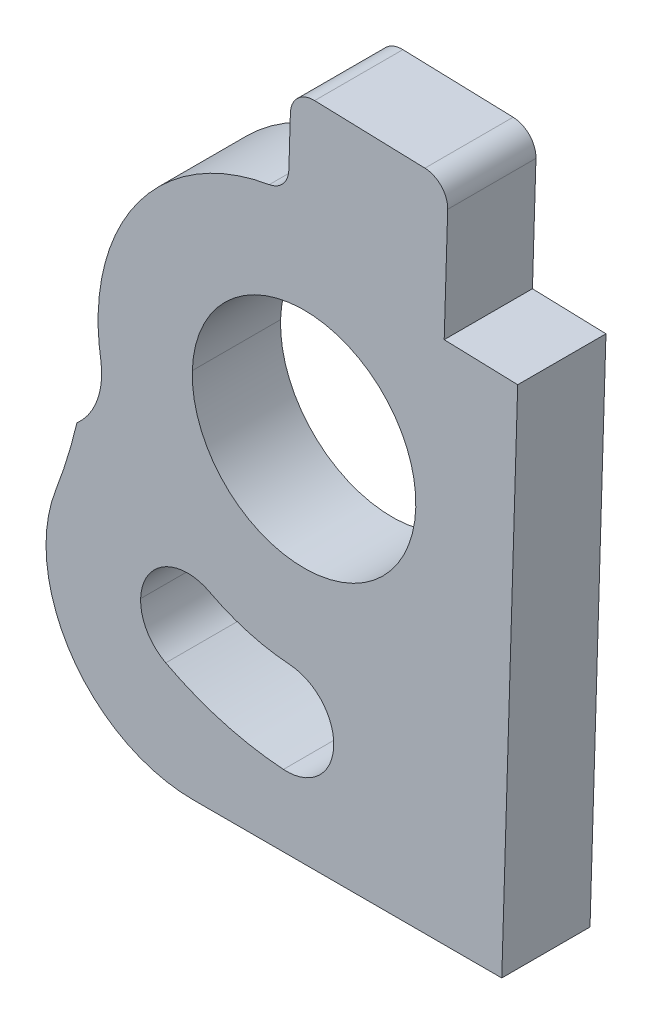
ISO-10303-21;
HEADER;
FILE_DESCRIPTION(('STEP AP214'),'2;1');
FILE_NAME('part.step','',(''),(''),'','','');
FILE_SCHEMA(('AUTOMOTIVE_DESIGN { 1 0 10303 214 1 1 1 1 }'));
ENDSEC;
DATA;
#1=APPLICATION_CONTEXT('core data for automotive mechanical design processes');
#2=APPLICATION_PROTOCOL_DEFINITION('international standard','automotive_design',2000,#1);
#3=PRODUCT_CONTEXT('',#1,'mechanical');
#4=PRODUCT('Part','Part','',(#3));
#5=PRODUCT_RELATED_PRODUCT_CATEGORY('part','',(#4));
#6=PRODUCT_DEFINITION_FORMATION('','',#4);
#7=PRODUCT_DEFINITION_CONTEXT('part definition',#1,'design');
#8=PRODUCT_DEFINITION('design','',#6,#7);
#9=PRODUCT_DEFINITION_SHAPE('','',#8);
#10=(LENGTH_UNIT() NAMED_UNIT(*) SI_UNIT(.MILLI.,.METRE.));
#11=(NAMED_UNIT(*) PLANE_ANGLE_UNIT() SI_UNIT($,.RADIAN.));
#12=(NAMED_UNIT(*) SI_UNIT($,.STERADIAN.) SOLID_ANGLE_UNIT());
#13=UNCERTAINTY_MEASURE_WITH_UNIT(LENGTH_MEASURE(1.E-05),#10,'distance_accuracy_value','');
#14=(GEOMETRIC_REPRESENTATION_CONTEXT(3) GLOBAL_UNCERTAINTY_ASSIGNED_CONTEXT((#13)) GLOBAL_UNIT_ASSIGNED_CONTEXT((#10,
#11,#12)) REPRESENTATION_CONTEXT('',''));
#15=CARTESIAN_POINT('',(0.,0.,0.));
#16=DIRECTION('',(0.,0.,1.));
#17=DIRECTION('',(1.,0.,0.));
#18=AXIS2_PLACEMENT_3D('',#15,#16,#17);
#19=CARTESIAN_POINT('',(8.92977845680518,-7.50608066992846,-4.));
#20=DIRECTION('',(0.,0.,-1.));
#21=DIRECTION('',(-1.,0.,0.));
#22=AXIS2_PLACEMENT_3D('',#19,#20,#21);
#23=CYLINDRICAL_SURFACE('',#22,5.);
#24=CARTESIAN_POINT('',(8.92977845680518,-7.50608066992846,-4.));
#25=DIRECTION('',(0.,0.,1.));
#26=DIRECTION('',(1.,0.,0.));
#27=AXIS2_PLACEMENT_3D('',#24,#25,#26);
#28=CIRCLE('',#27,5.);
#29=CARTESIAN_POINT('',(3.92977845680518,-7.50608066992846,-4.));
#30=VERTEX_POINT('',#29);
#31=CARTESIAN_POINT('',(8.92977370594984,-12.5060806699285,-4.));
#32=VERTEX_POINT('',#31);
#33=EDGE_CURVE('E40',#30,#32,#28,.T.);
#34=ORIENTED_EDGE('',*,*,#33,.F.);
#35=DIRECTION('',(0.,0.,-1.));
#36=VECTOR('',#35,1.);
#37=CARTESIAN_POINT('',(3.92977845680518,-7.50608066992846,-4.));
#38=LINE('',#37,#36);
#39=CARTESIAN_POINT('',(3.92977845680518,-7.50608066992846,-7.));
#40=VERTEX_POINT('',#39);
#41=EDGE_CURVE('E11',#30,#40,#38,.T.);
#42=ORIENTED_EDGE('',*,*,#41,.T.);
#43=CARTESIAN_POINT('',(8.92977845680518,-7.50608066992846,-7.));
#44=DIRECTION('',(0.,0.,-1.));
#45=DIRECTION('',(1.,0.,0.));
#46=AXIS2_PLACEMENT_3D('',#43,#44,#45);
#47=CIRCLE('',#46,5.);
#48=CARTESIAN_POINT('',(8.92977370594984,-12.5060806699285,-7.));
#49=VERTEX_POINT('',#48);
#50=EDGE_CURVE('E291',#49,#40,#47,.T.);
#51=ORIENTED_EDGE('',*,*,#50,.F.);
#52=DIRECTION('',(0.,0.,-1.));
#53=VECTOR('',#52,1.);
#54=CARTESIAN_POINT('',(8.92977845680518,-12.5060806699285,-4.));
#55=LINE('',#54,#53);
#56=EDGE_CURVE('E262',#32,#49,#55,.T.);
#57=ORIENTED_EDGE('',*,*,#56,.F.);
#58=EDGE_LOOP('',(#34,#42,#51,#57));
#59=FACE_BOUND('',#58,.T.);
#60=ADVANCED_FACE('F17',(#59),#23,.T.);
#61=CARTESIAN_POINT('',(12.7,0.,-4.));
#62=DIRECTION('',(0.,0.,-1.));
#63=DIRECTION('',(-0.999533590836713,0.0305385132098226,0.));
#64=AXIS2_PLACEMENT_3D('',#61,#62,#63);
#65=CYLINDRICAL_SURFACE('',#64,3.8);
#66=CARTESIAN_POINT('',(12.7,0.,-4.));
#67=DIRECTION('',(0.,0.,1.));
#68=DIRECTION('',(0.999533590836713,-0.0305385132098226,0.));
#69=AXIS2_PLACEMENT_3D('',#66,#67,#68);
#70=CIRCLE('',#69,3.8);
#71=CARTESIAN_POINT('',(8.90177235482049,0.116046350197326,-4.));
#72=VERTEX_POINT('',#71);
#73=CARTESIAN_POINT('',(16.4982276451795,-0.116046350197326,-4.));
#74=VERTEX_POINT('',#73);
#75=EDGE_CURVE('E28',#72,#74,#70,.T.);
#76=ORIENTED_EDGE('',*,*,#75,.T.);
#77=DIRECTION('',(0.,0.,-1.));
#78=VECTOR('',#77,1.);
#79=CARTESIAN_POINT('',(16.4982276451795,-0.116046350197325,-4.));
#80=LINE('',#79,#78);
#81=CARTESIAN_POINT('',(16.4982276451795,-0.116046350197326,-7.));
#82=VERTEX_POINT('',#81);
#83=EDGE_CURVE('E216',#74,#82,#80,.T.);
#84=ORIENTED_EDGE('',*,*,#83,.T.);
#85=CARTESIAN_POINT('',(12.7,0.,-7.));
#86=DIRECTION('',(0.,0.,1.));
#87=DIRECTION('',(0.999533590836713,-0.0305385132098226,0.));
#88=AXIS2_PLACEMENT_3D('',#85,#86,#87);
#89=CIRCLE('',#88,3.8);
#90=CARTESIAN_POINT('',(8.90177235482049,0.116046350197326,-7.));
#91=VERTEX_POINT('',#90);
#92=EDGE_CURVE('E287',#91,#82,#89,.T.);
#93=ORIENTED_EDGE('',*,*,#92,.F.);
#94=DIRECTION('',(0.,0.,-1.));
#95=VECTOR('',#94,1.);
#96=CARTESIAN_POINT('',(8.90177235482049,0.116046350197326,-4.));
#97=LINE('',#96,#95);
#98=EDGE_CURVE('E230',#72,#91,#97,.T.);
#99=ORIENTED_EDGE('',*,*,#98,.F.);
#100=EDGE_LOOP('',(#76,#84,#93,#99));
#101=FACE_BOUND('',#100,.T.);
#102=ADVANCED_FACE('F229',(#101),#65,.F.);
#103=CARTESIAN_POINT('',(12.7,0.,-4.));
#104=DIRECTION('',(0.,0.,-1.));
#105=DIRECTION('',(-0.999533590836713,0.0305385132098226,0.));
#106=AXIS2_PLACEMENT_3D('',#103,#104,#105);
#107=CYLINDRICAL_SURFACE('',#106,7.);
#108=CARTESIAN_POINT('',(12.7,0.,-4.));
#109=DIRECTION('',(0.,0.,1.));
#110=DIRECTION('',(0.998134798421867,-0.0610485395348597,0.));
#111=AXIS2_PLACEMENT_3D('',#108,#109,#110);
#112=CIRCLE('',#111,7.);
#113=CARTESIAN_POINT('',(5.70326486414301,0.213769592468759,-4.));
#114=VERTEX_POINT('',#113);
#115=CARTESIAN_POINT('',(5.78949751220482,-1.11577567914728,-4.));
#116=VERTEX_POINT('',#115);
#117=EDGE_CURVE('E268',#114,#116,#112,.T.);
#118=ORIENTED_EDGE('',*,*,#117,.F.);
#119=DIRECTION('',(0.,0.,-1.));
#120=VECTOR('',#119,1.);
#121=CARTESIAN_POINT('',(5.70326486414301,0.213769592468759,-4.));
#122=LINE('',#121,#120);
#123=CARTESIAN_POINT('',(5.70326486414301,0.213769592468759,-7.));
#124=VERTEX_POINT('',#123);
#125=EDGE_CURVE('E226',#114,#124,#122,.T.);
#126=ORIENTED_EDGE('',*,*,#125,.T.);
#127=CARTESIAN_POINT('',(12.7,0.,-7.));
#128=DIRECTION('',(0.,0.,1.));
#129=DIRECTION('',(0.998134798421867,-0.0610485395348597,0.));
#130=AXIS2_PLACEMENT_3D('',#127,#128,#129);
#131=CIRCLE('',#130,7.);
#132=CARTESIAN_POINT('',(5.78949751220482,-1.11577567914728,-7.));
#133=VERTEX_POINT('',#132);
#134=EDGE_CURVE('E336',#124,#133,#131,.T.);
#135=ORIENTED_EDGE('',*,*,#134,.T.);
#136=DIRECTION('',(0.,0.,-1.));
#137=VECTOR('',#136,1.);
#138=CARTESIAN_POINT('',(5.78949751220482,-1.11577567914728,-4.));
#139=LINE('',#138,#137);
#140=EDGE_CURVE('E237',#116,#133,#139,.T.);
#141=ORIENTED_EDGE('',*,*,#140,.F.);
#142=EDGE_LOOP('',(#118,#126,#135,#141));
#143=FACE_BOUND('',#142,.T.);
#144=ADVANCED_FACE('F490',(#143),#107,.T.);
#145=CARTESIAN_POINT('',(8.74394464196289,-7.523272293633,-4.));
#146=DIRECTION('',(0.,0.,-1.));
#147=DIRECTION('',(-0.999533590836713,0.0305385132098228,0.));
#148=AXIS2_PLACEMENT_3D('',#145,#146,#147);
#149=CYLINDRICAL_SURFACE('',#148,1.6);
#150=CARTESIAN_POINT('',(8.74394464196289,-7.523272293633,-4.));
#151=DIRECTION('',(0.,0.,-1.));
#152=DIRECTION('',(0.999533590836713,-0.0305385132098223,0.));
#153=AXIS2_PLACEMENT_3D('',#150,#151,#152);
#154=CIRCLE('',#153,1.6);
#155=CARTESIAN_POINT('',(7.14469089662415,-7.47441067249728,-4.));
#156=VERTEX_POINT('',#155);
#157=CARTESIAN_POINT('',(9.48861388582412,-6.10712692071144,-4.));
#158=VERTEX_POINT('',#157);
#159=EDGE_CURVE('E282',#156,#158,#154,.T.);
#160=ORIENTED_EDGE('',*,*,#159,.F.);
#161=DIRECTION('',(0.,0.,-1.));
#162=VECTOR('',#161,1.);
#163=CARTESIAN_POINT('',(7.14469089662415,-7.47441067249728,-4.));
#164=LINE('',#163,#162);
#165=CARTESIAN_POINT('',(7.14469089662415,-7.47441067249728,-7.));
#166=VERTEX_POINT('',#165);
#167=EDGE_CURVE('E332',#156,#166,#164,.T.);
#168=ORIENTED_EDGE('',*,*,#167,.T.);
#169=CARTESIAN_POINT('',(8.74394464196289,-7.523272293633,-7.));
#170=DIRECTION('',(0.,0.,-1.));
#171=DIRECTION('',(0.999533590836713,-0.0305385132098223,0.));
#172=AXIS2_PLACEMENT_3D('',#169,#170,#171);
#173=CIRCLE('',#172,1.6);
#174=CARTESIAN_POINT('',(9.48861388582412,-6.10712692071144,-7.));
#175=VERTEX_POINT('',#174);
#176=EDGE_CURVE('E337',#166,#175,#173,.T.);
#177=ORIENTED_EDGE('',*,*,#176,.T.);
#178=DIRECTION('',(0.,0.,-1.));
#179=VECTOR('',#178,1.);
#180=CARTESIAN_POINT('',(9.48861388582412,-6.10712692071144,-4.));
#181=LINE('',#180,#179);
#182=EDGE_CURVE('E296',#158,#175,#181,.T.);
#183=ORIENTED_EDGE('',*,*,#182,.F.);
#184=EDGE_LOOP('',(#160,#168,#177,#183));
#185=FACE_BOUND('',#184,.T.);
#186=ADVANCED_FACE('F762',(#185),#149,.F.);
#187=CARTESIAN_POINT('',(8.74394464196289,-7.523272293633,-4.));
#188=DIRECTION('',(0.,0.,-1.));
#189=DIRECTION('',(-0.999533590836713,0.0305385132098228,0.));
#190=AXIS2_PLACEMENT_3D('',#187,#188,#189);
#191=CYLINDRICAL_SURFACE('',#190,1.6);
#192=ORIENTED_EDGE('',*,*,#167,.F.);
#193=CARTESIAN_POINT('',(8.74394464196289,-7.523272293633,-4.));
#194=DIRECTION('',(0.,0.,-1.));
#195=DIRECTION('',(0.999533590836713,-0.0305385132098223,0.));
#196=AXIS2_PLACEMENT_3D('',#193,#194,#195);
#197=CIRCLE('',#196,1.6);
#198=CARTESIAN_POINT('',(7.99927539809305,-8.93941766655003,-4.));
#199=VERTEX_POINT('',#198);
#200=EDGE_CURVE('E278',#199,#156,#197,.T.);
#201=ORIENTED_EDGE('',*,*,#200,.F.);
#202=DIRECTION('',(0.,0.,-1.));
#203=VECTOR('',#202,1.);
#204=CARTESIAN_POINT('',(7.99927539809305,-8.93941766655003,-4.));
#205=LINE('',#204,#203);
#206=CARTESIAN_POINT('',(7.99927539809305,-8.93941766655003,-7.));
#207=VERTEX_POINT('',#206);
#208=EDGE_CURVE('E250',#199,#207,#205,.T.);
#209=ORIENTED_EDGE('',*,*,#208,.T.);
#210=CARTESIAN_POINT('',(8.74394464196289,-7.523272293633,-7.));
#211=DIRECTION('',(0.,0.,-1.));
#212=DIRECTION('',(0.999533590836713,-0.0305385132098223,0.));
#213=AXIS2_PLACEMENT_3D('',#210,#211,#212);
#214=CIRCLE('',#213,1.6);
#215=EDGE_CURVE('E348',#207,#166,#214,.T.);
#216=ORIENTED_EDGE('',*,*,#215,.T.);
#217=EDGE_LOOP('',(#192,#201,#209,#216));
#218=FACE_BOUND('',#217,.T.);
#219=ADVANCED_FACE('F757',(#218),#191,.F.);
#220=CARTESIAN_POINT('',(12.7,0.,-4.));
#221=DIRECTION('',(0.,0.,-1.));
#222=DIRECTION('',(-0.999533590836713,0.0305385132098226,0.));
#223=AXIS2_PLACEMENT_3D('',#220,#221,#222);
#224=CYLINDRICAL_SURFACE('',#223,6.9);
#225=CARTESIAN_POINT('',(12.7,0.,-7.));
#226=DIRECTION('',(0.,0.,1.));
#227=DIRECTION('',(0.999533590836713,-0.0305385132098226,0.));
#228=AXIS2_PLACEMENT_3D('',#225,#226,#227);
#229=CIRCLE('',#228,6.9);
#230=CARTESIAN_POINT('',(12.2216857109617,-6.88340144411917,-7.));
#231=VERTEX_POINT('',#230);
#232=EDGE_CURVE('E299',#175,#231,#229,.T.);
#233=ORIENTED_EDGE('',*,*,#232,.T.);
#234=DIRECTION('',(0.,0.,-1.));
#235=VECTOR('',#234,1.);
#236=CARTESIAN_POINT('',(12.2216857109617,-6.88340144411917,-4.));
#237=LINE('',#236,#235);
#238=CARTESIAN_POINT('',(12.2216857109617,-6.88340144411917,-4.));
#239=VERTEX_POINT('',#238);
#240=EDGE_CURVE('E264',#239,#231,#237,.T.);
#241=ORIENTED_EDGE('',*,*,#240,.F.);
#242=CARTESIAN_POINT('',(12.7,0.,-4.));
#243=DIRECTION('',(0.,0.,1.));
#244=DIRECTION('',(0.999533590836713,-0.0305385132098226,0.));
#245=AXIS2_PLACEMENT_3D('',#242,#243,#244);
#246=CIRCLE('',#245,6.9);
#247=EDGE_CURVE('E283',#158,#239,#246,.T.);
#248=ORIENTED_EDGE('',*,*,#247,.F.);
#249=ORIENTED_EDGE('',*,*,#182,.T.);
#250=EDGE_LOOP('',(#233,#241,#248,#249));
#251=FACE_BOUND('',#250,.T.);
#252=ADVANCED_FACE('F761',(#251),#224,.T.);
#253=CARTESIAN_POINT('',(12.110772252634,-8.47955250362507,-4.));
#254=DIRECTION('',(0.,0.,-1.));
#255=DIRECTION('',(-0.999533590836713,0.0305385132098228,0.));
#256=AXIS2_PLACEMENT_3D('',#253,#254,#255);
#257=CYLINDRICAL_SURFACE('',#256,1.6);
#258=CARTESIAN_POINT('',(12.110772252634,-8.47955250362507,-7.));
#259=DIRECTION('',(0.,0.,-1.));
#260=DIRECTION('',(0.999533590836713,-0.0305385132098228,0.));
#261=AXIS2_PLACEMENT_3D('',#258,#259,#260);
#262=CIRCLE('',#261,1.6);
#263=CARTESIAN_POINT('',(11.9998587943094,-10.0757035631312,-7.));
#264=VERTEX_POINT('',#263);
#265=EDGE_CURVE('E267',#231,#264,#262,.T.);
#266=ORIENTED_EDGE('',*,*,#265,.T.);
#267=DIRECTION('',(0.,0.,-1.));
#268=VECTOR('',#267,1.);
#269=CARTESIAN_POINT('',(11.9998587943094,-10.0757035631312,-4.));
#270=LINE('',#269,#268);
#271=CARTESIAN_POINT('',(11.9998587943094,-10.0757035631312,-4.));
#272=VERTEX_POINT('',#271);
#273=EDGE_CURVE('E318',#272,#264,#270,.T.);
#274=ORIENTED_EDGE('',*,*,#273,.F.);
#275=CARTESIAN_POINT('',(12.110772252634,-8.47955250362507,-4.));
#276=DIRECTION('',(0.,0.,-1.));
#277=DIRECTION('',(0.999533590836713,-0.0305385132098228,0.));
#278=AXIS2_PLACEMENT_3D('',#275,#276,#277);
#279=CIRCLE('',#278,1.6);
#280=EDGE_CURVE('E286',#239,#272,#279,.T.);
#281=ORIENTED_EDGE('',*,*,#280,.F.);
#282=ORIENTED_EDGE('',*,*,#240,.T.);
#283=EDGE_LOOP('',(#266,#274,#281,#282));
#284=FACE_BOUND('',#283,.T.);
#285=ADVANCED_FACE('F378',(#284),#257,.F.);
#286=CARTESIAN_POINT('',(19.3601122011978,-12.5060806699285,-4.));
#287=DIRECTION('',(0.,-1.,0.));
#288=DIRECTION('',(0.,0.,-1.));
#289=AXIS2_PLACEMENT_3D('',#286,#287,#288);
#290=PLANE('',#289);
#291=DIRECTION('',(1.,0.,0.));
#292=VECTOR('',#291,1.);
#293=CARTESIAN_POINT('',(19.3601122011978,-12.5060806699285,-4.));
#294=LINE('',#293,#292);
#295=CARTESIAN_POINT('',(19.421217727795,-12.5060806699285,-4.));
#296=VERTEX_POINT('',#295);
#297=EDGE_CURVE('E323',#32,#296,#294,.T.);
#298=ORIENTED_EDGE('',*,*,#297,.F.);
#299=ORIENTED_EDGE('',*,*,#56,.T.);
#300=DIRECTION('',(1.,0.,0.));
#301=VECTOR('',#300,1.);
#302=CARTESIAN_POINT('',(19.3601122011978,-12.5060806699285,-7.));
#303=LINE('',#302,#301);
#304=CARTESIAN_POINT('',(19.421217727795,-12.5060806699285,-7.));
#305=VERTEX_POINT('',#304);
#306=EDGE_CURVE('E258',#49,#305,#303,.T.);
#307=ORIENTED_EDGE('',*,*,#306,.T.);
#308=DIRECTION('',(0.,0.,-1.));
#309=VECTOR('',#308,1.);
#310=CARTESIAN_POINT('',(19.421217727795,-12.5060806699285,-4.));
#311=LINE('',#310,#309);
#312=EDGE_CURVE('E263',#296,#305,#311,.T.);
#313=ORIENTED_EDGE('',*,*,#312,.F.);
#314=EDGE_LOOP('',(#298,#299,#307,#313));
#315=FACE_BOUND('',#314,.T.);
#316=ADVANCED_FACE('F518',(#315),#290,.T.);
#317=CARTESIAN_POINT('',(19.6302535979471,-5.66428151384983,-4.));
#318=DIRECTION('',(-0.999533590836713,0.0305385132098226,0.));
#319=DIRECTION('',(0.,0.,1.));
#320=AXIS2_PLACEMENT_3D('',#317,#318,#319);
#321=PLANE('',#320);
#322=DIRECTION('',(0.,0.,-1.));
#323=VECTOR('',#322,1.);
#324=CARTESIAN_POINT('',(19.9631233919342,5.23063462627035,-4.));
#325=LINE('',#324,#323);
#326=CARTESIAN_POINT('',(19.9631233919342,5.23063462627035,-4.));
#327=VERTEX_POINT('',#326);
#328=CARTESIAN_POINT('',(19.9631233919342,5.23063462627035,-7.));
#329=VERTEX_POINT('',#328);
#330=EDGE_CURVE('E21',#327,#329,#325,.T.);
#331=ORIENTED_EDGE('',*,*,#330,.F.);
#332=DIRECTION('',(0.0305385132098226,0.999533590836713,0.));
#333=VECTOR('',#332,1.);
#334=CARTESIAN_POINT('',(19.6302535979471,-5.66428151384983,-4.));
#335=LINE('',#334,#333);
#336=EDGE_CURVE('E326',#296,#327,#335,.T.);
#337=ORIENTED_EDGE('',*,*,#336,.F.);
#338=ORIENTED_EDGE('',*,*,#312,.T.);
#339=DIRECTION('',(0.0305385132098226,0.999533590836713,0.));
#340=VECTOR('',#339,1.);
#341=CARTESIAN_POINT('',(19.6302535979471,-5.66428151384983,-7.));
#342=LINE('',#341,#340);
#343=EDGE_CURVE('E355',#305,#329,#342,.T.);
#344=ORIENTED_EDGE('',*,*,#343,.T.);
#345=EDGE_LOOP('',(#331,#337,#338,#344));
#346=FACE_BOUND('',#345,.T.);
#347=ADVANCED_FACE('F514',(#346),#321,.F.);
#348=CARTESIAN_POINT('',(21.6123538168192,5.180246079474,-4.));
#349=DIRECTION('',(-0.0305385132098228,-0.999533590836713,0.));
#350=DIRECTION('',(-0.999533590836713,0.0305385132098228,0.));
#351=AXIS2_PLACEMENT_3D('',#348,#349,#350);
#352=PLANE('',#351);
#353=DIRECTION('',(-0.999533590836713,0.0305385132098228,0.));
#354=VECTOR('',#353,1.);
#355=CARTESIAN_POINT('',(21.6123538168192,5.180246079474,-7.));
#356=LINE('',#355,#354);
#357=CARTESIAN_POINT('',(17.4642894148424,5.3069809092949,-7.));
#358=VERTEX_POINT('',#357);
#359=EDGE_CURVE('E359',#329,#358,#356,.T.);
#360=ORIENTED_EDGE('',*,*,#359,.T.);
#361=DIRECTION('',(0.,0.,-1.));
#362=VECTOR('',#361,1.);
#363=CARTESIAN_POINT('',(17.4642894148424,5.3069809092949,-4.));
#364=LINE('',#363,#362);
#365=CARTESIAN_POINT('',(17.4642894148424,5.3069809092949,-4.));
#366=VERTEX_POINT('',#365);
#367=EDGE_CURVE('E449',#366,#358,#364,.T.);
#368=ORIENTED_EDGE('',*,*,#367,.F.);
#369=DIRECTION('',(-0.999533590836713,0.0305385132098228,0.));
#370=VECTOR('',#369,1.);
#371=CARTESIAN_POINT('',(21.6123538168192,5.180246079474,-4.));
#372=LINE('',#371,#370);
#373=EDGE_CURVE('E399',#327,#366,#372,.T.);
#374=ORIENTED_EDGE('',*,*,#373,.F.);
#375=ORIENTED_EDGE('',*,*,#330,.T.);
#376=EDGE_LOOP('',(#360,#368,#374,#375));
#377=FACE_BOUND('',#376,.T.);
#378=ADVANCED_FACE('F795',(#377),#352,.F.);
#379=CARTESIAN_POINT('',(17.4642894148424,5.3069809092949,-4.));
#380=DIRECTION('',(-0.999533590836713,0.0305385132098226,0.));
#381=DIRECTION('',(0.,0.,1.));
#382=AXIS2_PLACEMENT_3D('',#379,#380,#381);
#383=PLANE('',#382);
#384=DIRECTION('',(0.0305385132098226,0.999533590836713,0.));
#385=VECTOR('',#384,1.);
#386=CARTESIAN_POINT('',(17.4642894148424,5.3069809092949,-4.));
#387=LINE('',#386,#385);
#388=CARTESIAN_POINT('',(17.5833896163607,9.20516191355808,-4.));
#389=VERTEX_POINT('',#388);
#390=EDGE_CURVE('E256',#366,#389,#387,.T.);
#391=ORIENTED_EDGE('',*,*,#390,.F.);
#392=ORIENTED_EDGE('',*,*,#367,.T.);
#393=DIRECTION('',(0.0305385132098226,0.999533590836713,0.));
#394=VECTOR('',#393,1.);
#395=CARTESIAN_POINT('',(17.4642894148424,5.3069809092949,-7.));
#396=LINE('',#395,#394);
#397=CARTESIAN_POINT('',(17.5833896163607,9.20516191355808,-7.));
#398=VERTEX_POINT('',#397);
#399=EDGE_CURVE('E415',#358,#398,#396,.T.);
#400=ORIENTED_EDGE('',*,*,#399,.T.);
#401=DIRECTION('',(0.,0.,1.));
#402=VECTOR('',#401,1.);
#403=CARTESIAN_POINT('',(17.5833896163607,9.20516191355808,-4.));
#404=LINE('',#403,#402);
#405=EDGE_CURVE('E411',#398,#389,#404,.T.);
#406=ORIENTED_EDGE('',*,*,#405,.T.);
#407=EDGE_LOOP('',(#391,#392,#400,#406));
#408=FACE_BOUND('',#407,.T.);
#409=ADVANCED_FACE('F520',(#408),#383,.F.);
#410=CARTESIAN_POINT('',(17.6078204269286,10.0047887862274,-4.));
#411=DIRECTION('',(-0.030538513209823,-0.999533590836713,0.));
#412=DIRECTION('',(-0.999533590836713,0.030538513209823,0.));
#413=AXIS2_PLACEMENT_3D('',#410,#411,#412);
#414=PLANE('',#413);
#415=DIRECTION('',(-0.999533590836713,0.030538513209823,0.));
#416=VECTOR('',#415,1.);
#417=CARTESIAN_POINT('',(17.6078204269286,10.0047887862274,-4.));
#418=LINE('',#417,#416);
#419=CARTESIAN_POINT('',(16.8081935542592,10.0292195967953,-4.));
#420=VERTEX_POINT('',#419);
#421=CARTESIAN_POINT('',(13.0599425886215,10.1437390213321,-4.));
#422=VERTEX_POINT('',#421);
#423=EDGE_CURVE('E257',#420,#422,#418,.T.);
#424=ORIENTED_EDGE('',*,*,#423,.F.);
#425=DIRECTION('',(0.,0.,-1.));
#426=VECTOR('',#425,1.);
#427=CARTESIAN_POINT('',(16.8081935542592,10.0292195967953,-4.));
#428=LINE('',#427,#426);
#429=CARTESIAN_POINT('',(16.8081935542592,10.0292195967953,-7.));
#430=VERTEX_POINT('',#429);
#431=EDGE_CURVE('E314',#420,#430,#428,.T.);
#432=ORIENTED_EDGE('',*,*,#431,.T.);
#433=DIRECTION('',(-0.999533590836713,0.030538513209823,0.));
#434=VECTOR('',#433,1.);
#435=CARTESIAN_POINT('',(17.6078204269286,10.0047887862274,-7.));
#436=LINE('',#435,#434);
#437=CARTESIAN_POINT('',(13.0599425886215,10.1437390213321,-7.));
#438=VERTEX_POINT('',#437);
#439=EDGE_CURVE('E304',#430,#438,#436,.T.);
#440=ORIENTED_EDGE('',*,*,#439,.T.);
#441=DIRECTION('',(0.,0.,1.));
#442=VECTOR('',#441,1.);
#443=CARTESIAN_POINT('',(13.0599425886215,10.1437390213321,-4.));
#444=LINE('',#443,#442);
#445=EDGE_CURVE('E300',#438,#422,#444,.T.);
#446=ORIENTED_EDGE('',*,*,#445,.T.);
#447=EDGE_LOOP('',(#424,#432,#440,#446));
#448=FACE_BOUND('',#447,.T.);
#449=ADVANCED_FACE('F803',(#448),#414,.F.);
#450=CARTESIAN_POINT('',(12.2603157159522,10.1681698319,-4.));
#451=DIRECTION('',(0.999533590836713,-0.0305385132098225,0.));
#452=DIRECTION('',(0.,0.,-1.));
#453=AXIS2_PLACEMENT_3D('',#450,#451,#452);
#454=PLANE('',#453);
#455=DIRECTION('',(-0.0305385132098225,-0.999533590836713,0.));
#456=VECTOR('',#455,1.);
#457=CARTESIAN_POINT('',(12.2603157159522,10.1681698319,-7.));
#458=LINE('',#457,#456);
#459=CARTESIAN_POINT('',(12.2358849053843,9.36854295923063,-7.));
#460=VERTEX_POINT('',#459);
#461=CARTESIAN_POINT('',(12.1837997128717,7.66378087262213,-7.));
#462=VERTEX_POINT('',#461);
#463=EDGE_CURVE('E305',#460,#462,#458,.T.);
#464=ORIENTED_EDGE('',*,*,#463,.T.);
#465=DIRECTION('',(0.,0.,1.));
#466=VECTOR('',#465,1.);
#467=CARTESIAN_POINT('',(12.1837997128717,7.66378087262213,-4.));
#468=LINE('',#467,#466);
#469=CARTESIAN_POINT('',(12.1837997128717,7.66378087262213,-4.));
#470=VERTEX_POINT('',#469);
#471=EDGE_CURVE('E309',#462,#470,#468,.T.);
#472=ORIENTED_EDGE('',*,*,#471,.T.);
#473=DIRECTION('',(-0.0305385132098225,-0.999533590836713,0.));
#474=VECTOR('',#473,1.);
#475=CARTESIAN_POINT('',(12.2603157159522,10.1681698319,-4.));
#476=LINE('',#475,#474);
#477=CARTESIAN_POINT('',(12.2358849053843,9.36854295923063,-4.));
#478=VERTEX_POINT('',#477);
#479=EDGE_CURVE('E341',#478,#470,#476,.T.);
#480=ORIENTED_EDGE('',*,*,#479,.F.);
#481=DIRECTION('',(0.,0.,-1.));
#482=VECTOR('',#481,1.);
#483=CARTESIAN_POINT('',(12.2358849053843,9.36854295923063,-4.));
#484=LINE('',#483,#482);
#485=EDGE_CURVE('E306',#478,#460,#484,.T.);
#486=ORIENTED_EDGE('',*,*,#485,.T.);
#487=EDGE_LOOP('',(#464,#472,#480,#486));
#488=FACE_BOUND('',#487,.T.);
#489=ADVANCED_FACE('F779',(#488),#454,.F.);
#490=CARTESIAN_POINT('',(12.7,0.,-4.));
#491=DIRECTION('',(0.,0.,-1.));
#492=DIRECTION('',(-0.999533590836713,0.0305385132098226,0.));
#493=AXIS2_PLACEMENT_3D('',#490,#491,#492);
#494=CYLINDRICAL_SURFACE('',#493,7.);
#495=ORIENTED_EDGE('',*,*,#125,.F.);
#496=CARTESIAN_POINT('',(12.7,0.,-4.));
#497=DIRECTION('',(0.,0.,1.));
#498=DIRECTION('',(0.998134798421867,-0.0610485395348597,0.));
#499=AXIS2_PLACEMENT_3D('',#496,#497,#498);
#500=CIRCLE('',#499,7.);
#501=CARTESIAN_POINT('',(11.5191294719765,6.89967715158076,-4.));
#502=VERTEX_POINT('',#501);
#503=EDGE_CURVE('E271',#502,#114,#500,.T.);
#504=ORIENTED_EDGE('',*,*,#503,.F.);
#505=DIRECTION('',(0.,0.,-1.));
#506=VECTOR('',#505,1.);
#507=CARTESIAN_POINT('',(11.5191294719765,6.89967715158076,-4.));
#508=LINE('',#507,#506);
#509=CARTESIAN_POINT('',(11.5191294719765,6.89967715158076,-7.));
#510=VERTEX_POINT('',#509);
#511=EDGE_CURVE('E310',#502,#510,#508,.T.);
#512=ORIENTED_EDGE('',*,*,#511,.T.);
#513=CARTESIAN_POINT('',(12.7,0.,-7.));
#514=DIRECTION('',(0.,0.,1.));
#515=DIRECTION('',(0.998134798421867,-0.0610485395348597,0.));
#516=AXIS2_PLACEMENT_3D('',#513,#514,#515);
#517=CIRCLE('',#516,7.);
#518=EDGE_CURVE('E322',#510,#124,#517,.T.);
#519=ORIENTED_EDGE('',*,*,#518,.T.);
#520=EDGE_LOOP('',(#495,#504,#512,#519));
#521=FACE_BOUND('',#520,.T.);
#522=ADVANCED_FACE('F474',(#521),#494,.T.);
#523=CARTESIAN_POINT('',(3.32146090942081,-1.51426699312845,-4.));
#524=DIRECTION('',(0.,0.,-1.));
#525=DIRECTION('',(-0.999533590836713,0.0305385132098226,0.));
#526=AXIS2_PLACEMENT_3D('',#523,#524,#525);
#527=CYLINDRICAL_SURFACE('',#526,2.5);
#528=CARTESIAN_POINT('',(3.32146090942081,-1.51426699312845,-7.));
#529=DIRECTION('',(0.,0.,-1.));
#530=DIRECTION('',(0.998134798421867,-0.0610485395348593,0.));
#531=AXIS2_PLACEMENT_3D('',#528,#529,#530);
#532=CIRCLE('',#531,2.5);
#533=CARTESIAN_POINT('',(4.97815807484942,-3.38652619047823,-7.));
#534=VERTEX_POINT('',#533);
#535=EDGE_CURVE('E244',#133,#534,#532,.T.);
#536=ORIENTED_EDGE('',*,*,#535,.T.);
#537=DIRECTION('',(0.,0.,-1.));
#538=VECTOR('',#537,1.);
#539=CARTESIAN_POINT('',(4.97815807484941,-3.38652619047824,-5.5));
#540=LINE('',#539,#538);
#541=CARTESIAN_POINT('',(4.97815807484942,-3.38652619047823,-4.));
#542=VERTEX_POINT('',#541);
#543=EDGE_CURVE('E273',#542,#534,#540,.T.);
#544=ORIENTED_EDGE('',*,*,#543,.F.);
#545=CARTESIAN_POINT('',(3.32146090942081,-1.51426699312845,-4.));
#546=DIRECTION('',(0.,0.,-1.));
#547=DIRECTION('',(0.998134798421867,-0.0610485395348593,0.));
#548=AXIS2_PLACEMENT_3D('',#545,#546,#547);
#549=CIRCLE('',#548,2.5);
#550=EDGE_CURVE('E272',#116,#542,#549,.T.);
#551=ORIENTED_EDGE('',*,*,#550,.F.);
#552=ORIENTED_EDGE('',*,*,#140,.T.);
#553=EDGE_LOOP('',(#536,#544,#551,#552));
#554=FACE_BOUND('',#553,.T.);
#555=ADVANCED_FACE('F778',(#554),#527,.F.);
#556=CARTESIAN_POINT('',(12.7,0.,-4.));
#557=DIRECTION('',(0.,0.,-1.));
#558=DIRECTION('',(-0.999533590836713,0.0305385132098226,0.));
#559=AXIS2_PLACEMENT_3D('',#556,#557,#558);
#560=CYLINDRICAL_SURFACE('',#559,3.8);
#561=ORIENTED_EDGE('',*,*,#83,.F.);
#562=CARTESIAN_POINT('',(12.7,0.,-4.));
#563=DIRECTION('',(0.,0.,1.));
#564=DIRECTION('',(0.999533590836713,-0.0305385132098226,0.));
#565=AXIS2_PLACEMENT_3D('',#562,#563,#564);
#566=CIRCLE('',#565,3.8);
#567=EDGE_CURVE('E221',#74,#72,#566,.T.);
#568=ORIENTED_EDGE('',*,*,#567,.T.);
#569=ORIENTED_EDGE('',*,*,#98,.T.);
#570=CARTESIAN_POINT('',(12.7,0.,-7.));
#571=DIRECTION('',(0.,0.,1.));
#572=DIRECTION('',(0.999533590836713,-0.0305385132098226,0.));
#573=AXIS2_PLACEMENT_3D('',#570,#571,#572);
#574=CIRCLE('',#573,3.8);
#575=EDGE_CURVE('E223',#82,#91,#574,.T.);
#576=ORIENTED_EDGE('',*,*,#575,.F.);
#577=EDGE_LOOP('',(#561,#568,#569,#576));
#578=FACE_BOUND('',#577,.T.);
#579=ADVANCED_FACE('F218',(#578),#560,.F.);
#580=CARTESIAN_POINT('',(-12.6881532072525,0.775678235529495,-4.));
#581=DIRECTION('',(0.,0.,-1.));
#582=DIRECTION('',(-0.999533590836713,0.0305385132098226,0.));
#583=AXIS2_PLACEMENT_3D('',#580,#581,#582);
#584=CYLINDRICAL_SURFACE('',#583,18.15);
#585=CARTESIAN_POINT('',(-12.6881532072525,0.775678235529495,-7.));
#586=DIRECTION('',(0.,0.,-1.));
#587=DIRECTION('',(1.,0.,0.));
#588=AXIS2_PLACEMENT_3D('',#585,#586,#587);
#589=CIRCLE('',#588,18.15);
#590=CARTESIAN_POINT('',(4.26067874534563,-5.71736384369564,-7.));
#591=VERTEX_POINT('',#590);
#592=EDGE_CURVE('E246',#534,#591,#589,.T.);
#593=ORIENTED_EDGE('',*,*,#592,.T.);
#594=DIRECTION('',(0.,0.,1.));
#595=VECTOR('',#594,1.);
#596=CARTESIAN_POINT('',(4.26067874534563,-5.71736384369564,-7.));
#597=LINE('',#596,#595);
#598=CARTESIAN_POINT('',(4.26067874534563,-5.71736384369564,-4.));
#599=VERTEX_POINT('',#598);
#600=EDGE_CURVE('E276',#591,#599,#597,.T.);
#601=ORIENTED_EDGE('',*,*,#600,.T.);
#602=CARTESIAN_POINT('',(-12.6881532072525,0.775678235529495,-4.));
#603=DIRECTION('',(0.,0.,-1.));
#604=DIRECTION('',(1.,0.,0.));
#605=AXIS2_PLACEMENT_3D('',#602,#603,#604);
#606=CIRCLE('',#605,18.15);
#607=EDGE_CURVE('E346',#542,#599,#606,.T.);
#608=ORIENTED_EDGE('',*,*,#607,.F.);
#609=ORIENTED_EDGE('',*,*,#543,.T.);
#610=EDGE_LOOP('',(#593,#601,#608,#609));
#611=FACE_BOUND('',#610,.T.);
#612=ADVANCED_FACE('F787',(#611),#584,.F.);
#613=CARTESIAN_POINT('',(12.7,0.,-4.));
#614=DIRECTION('',(0.,0.,-1.));
#615=DIRECTION('',(-0.999533590836713,0.0305385132098226,0.));
#616=AXIS2_PLACEMENT_3D('',#613,#614,#615);
#617=CYLINDRICAL_SURFACE('',#616,10.1);
#618=CARTESIAN_POINT('',(12.7,0.,-7.));
#619=DIRECTION('',(0.,0.,-1.));
#620=DIRECTION('',(0.999533590836713,-0.0305385132098225,0.));
#621=AXIS2_PLACEMENT_3D('',#618,#619,#620);
#622=CIRCLE('',#621,10.1);
#623=EDGE_CURVE('E277',#264,#207,#622,.T.);
#624=ORIENTED_EDGE('',*,*,#623,.T.);
#625=ORIENTED_EDGE('',*,*,#208,.F.);
#626=CARTESIAN_POINT('',(12.7,0.,-4.));
#627=DIRECTION('',(0.,0.,-1.));
#628=DIRECTION('',(0.999533590836713,-0.0305385132098225,0.));
#629=AXIS2_PLACEMENT_3D('',#626,#627,#628);
#630=CIRCLE('',#629,10.1);
#631=EDGE_CURVE('E294',#272,#199,#630,.T.);
#632=ORIENTED_EDGE('',*,*,#631,.F.);
#633=ORIENTED_EDGE('',*,*,#273,.T.);
#634=EDGE_LOOP('',(#624,#625,#632,#633));
#635=FACE_BOUND('',#634,.T.);
#636=ADVANCED_FACE('F388',(#635),#617,.F.);
#637=CARTESIAN_POINT('',(12.7,0.,-4.));
#638=DIRECTION('',(0.,0.,1.));
#639=DIRECTION('',(1.,0.,0.));
#640=AXIS2_PLACEMENT_3D('',#637,#638,#639);
#641=PLANE('',#640);
#642=ORIENTED_EDGE('',*,*,#607,.T.);
#643=CARTESIAN_POINT('',(8.92977845680518,-7.50608066992846,-4.));
#644=DIRECTION('',(0.,0.,1.));
#645=DIRECTION('',(1.,0.,0.));
#646=AXIS2_PLACEMENT_3D('',#643,#644,#645);
#647=CIRCLE('',#646,5.);
#648=EDGE_CURVE('E407',#599,#30,#647,.T.);
#649=ORIENTED_EDGE('',*,*,#648,.T.);
#650=ORIENTED_EDGE('',*,*,#33,.T.);
#651=ORIENTED_EDGE('',*,*,#297,.T.);
#652=ORIENTED_EDGE('',*,*,#336,.T.);
#653=ORIENTED_EDGE('',*,*,#373,.T.);
#654=ORIENTED_EDGE('',*,*,#390,.T.);
#655=CARTESIAN_POINT('',(16.7837627436913,9.22959272412594,-4.));
#656=DIRECTION('',(0.,0.,1.));
#657=DIRECTION('',(0.999533590836713,-0.0305385132098227,0.));
#658=AXIS2_PLACEMENT_3D('',#655,#656,#657);
#659=CIRCLE('',#658,0.8);
#660=EDGE_CURVE('E252',#389,#420,#659,.T.);
#661=ORIENTED_EDGE('',*,*,#660,.T.);
#662=ORIENTED_EDGE('',*,*,#423,.T.);
#663=CARTESIAN_POINT('',(13.0355117780537,9.34411214866278,-4.));
#664=DIRECTION('',(0.,0.,1.));
#665=DIRECTION('',(0.999533590836713,-0.0305385132098228,0.));
#666=AXIS2_PLACEMENT_3D('',#663,#664,#665);
#667=CIRCLE('',#666,0.8);
#668=EDGE_CURVE('E340',#422,#478,#667,.T.);
#669=ORIENTED_EDGE('',*,*,#668,.T.);
#670=ORIENTED_EDGE('',*,*,#479,.T.);
#671=CARTESIAN_POINT('',(11.3841728402024,7.68821168318998,-4.));
#672=DIRECTION('',(0.,0.,-1.));
#673=DIRECTION('',(0.999533590836713,-0.0305385132098228,0.));
#674=AXIS2_PLACEMENT_3D('',#671,#672,#673);
#675=CIRCLE('',#674,0.8);
#676=EDGE_CURVE('E344',#470,#502,#675,.T.);
#677=ORIENTED_EDGE('',*,*,#676,.T.);
#678=ORIENTED_EDGE('',*,*,#503,.T.);
#679=ORIENTED_EDGE('',*,*,#117,.T.);
#680=ORIENTED_EDGE('',*,*,#550,.T.);
#681=EDGE_LOOP('',(#642,#649,#650,#651,#652,#653,#654,#661,#662,#669,#670,#677,#678,#679,#680));
#682=FACE_BOUND('',#681,.T.);
#683=ORIENTED_EDGE('',*,*,#75,.F.);
#684=ORIENTED_EDGE('',*,*,#567,.F.);
#685=EDGE_LOOP('',(#683,#684));
#686=FACE_BOUND('',#685,.T.);
#687=ORIENTED_EDGE('',*,*,#200,.T.);
#688=ORIENTED_EDGE('',*,*,#159,.T.);
#689=ORIENTED_EDGE('',*,*,#247,.T.);
#690=ORIENTED_EDGE('',*,*,#280,.T.);
#691=ORIENTED_EDGE('',*,*,#631,.T.);
#692=EDGE_LOOP('',(#687,#688,#689,#690,#691));
#693=FACE_BOUND('',#692,.T.);
#694=ADVANCED_FACE('F234',(#682,#686,#693),#641,.T.);
#695=CARTESIAN_POINT('',(12.7,0.,-7.));
#696=DIRECTION('',(0.,0.,1.));
#697=DIRECTION('',(1.,0.,0.));
#698=AXIS2_PLACEMENT_3D('',#695,#696,#697);
#699=PLANE('',#698);
#700=ORIENTED_EDGE('',*,*,#306,.F.);
#701=ORIENTED_EDGE('',*,*,#50,.T.);
#702=CARTESIAN_POINT('',(8.92977845680518,-7.50608066992846,-7.));
#703=DIRECTION('',(0.,0.,-1.));
#704=DIRECTION('',(1.,0.,0.));
#705=AXIS2_PLACEMENT_3D('',#702,#703,#704);
#706=CIRCLE('',#705,5.);
#707=EDGE_CURVE('E295',#40,#591,#706,.T.);
#708=ORIENTED_EDGE('',*,*,#707,.T.);
#709=ORIENTED_EDGE('',*,*,#592,.F.);
#710=ORIENTED_EDGE('',*,*,#535,.F.);
#711=ORIENTED_EDGE('',*,*,#134,.F.);
#712=ORIENTED_EDGE('',*,*,#518,.F.);
#713=CARTESIAN_POINT('',(11.3841728402024,7.68821168318998,-7.));
#714=DIRECTION('',(0.,0.,1.));
#715=DIRECTION('',(0.999533590836713,-0.0305385132098228,0.));
#716=AXIS2_PLACEMENT_3D('',#713,#714,#715);
#717=CIRCLE('',#716,0.8);
#718=EDGE_CURVE('E482',#510,#462,#717,.T.);
#719=ORIENTED_EDGE('',*,*,#718,.T.);
#720=ORIENTED_EDGE('',*,*,#463,.F.);
#721=CARTESIAN_POINT('',(13.0355117780537,9.34411214866278,-7.));
#722=DIRECTION('',(0.,0.,-1.));
#723=DIRECTION('',(0.999533590836713,-0.0305385132098207,0.));
#724=AXIS2_PLACEMENT_3D('',#721,#722,#723);
#725=CIRCLE('',#724,0.8);
#726=EDGE_CURVE('E421',#460,#438,#725,.T.);
#727=ORIENTED_EDGE('',*,*,#726,.T.);
#728=ORIENTED_EDGE('',*,*,#439,.F.);
#729=CARTESIAN_POINT('',(16.7837627436913,9.22959272412594,-7.));
#730=DIRECTION('',(0.,0.,-1.));
#731=DIRECTION('',(0.999533590836713,-0.0305385132098162,0.));
#732=AXIS2_PLACEMENT_3D('',#729,#730,#731);
#733=CIRCLE('',#732,0.8);
#734=EDGE_CURVE('E290',#430,#398,#733,.T.);
#735=ORIENTED_EDGE('',*,*,#734,.T.);
#736=ORIENTED_EDGE('',*,*,#399,.F.);
#737=ORIENTED_EDGE('',*,*,#359,.F.);
#738=ORIENTED_EDGE('',*,*,#343,.F.);
#739=EDGE_LOOP('',(#700,#701,#708,#709,#710,#711,#712,#719,#720,#727,#728,#735,#736,#737,#738));
#740=FACE_BOUND('',#739,.T.);
#741=ORIENTED_EDGE('',*,*,#92,.T.);
#742=ORIENTED_EDGE('',*,*,#575,.T.);
#743=EDGE_LOOP('',(#741,#742));
#744=FACE_BOUND('',#743,.T.);
#745=ORIENTED_EDGE('',*,*,#215,.F.);
#746=ORIENTED_EDGE('',*,*,#623,.F.);
#747=ORIENTED_EDGE('',*,*,#265,.F.);
#748=ORIENTED_EDGE('',*,*,#232,.F.);
#749=ORIENTED_EDGE('',*,*,#176,.F.);
#750=EDGE_LOOP('',(#745,#746,#747,#748,#749));
#751=FACE_BOUND('',#750,.T.);
#752=ADVANCED_FACE('F19',(#740,#744,#751),#699,.F.);
#753=CARTESIAN_POINT('',(11.3841728402024,7.68821168318998,-4.));
#754=DIRECTION('',(0.,0.,-1.));
#755=DIRECTION('',(-0.999533590836713,0.0305385132098228,0.));
#756=AXIS2_PLACEMENT_3D('',#753,#754,#755);
#757=CYLINDRICAL_SURFACE('',#756,0.8);
#758=ORIENTED_EDGE('',*,*,#676,.F.);
#759=ORIENTED_EDGE('',*,*,#471,.F.);
#760=ORIENTED_EDGE('',*,*,#718,.F.);
#761=ORIENTED_EDGE('',*,*,#511,.F.);
#762=EDGE_LOOP('',(#758,#759,#760,#761));
#763=FACE_BOUND('',#762,.T.);
#764=ADVANCED_FACE('F496',(#763),#757,.F.);
#765=CARTESIAN_POINT('',(16.7837627436913,9.22959272412594,-4.));
#766=DIRECTION('',(0.,0.,-1.));
#767=DIRECTION('',(-0.999533590836713,0.0305385132098227,0.));
#768=AXIS2_PLACEMENT_3D('',#765,#766,#767);
#769=CYLINDRICAL_SURFACE('',#768,0.8);
#770=ORIENTED_EDGE('',*,*,#660,.F.);
#771=ORIENTED_EDGE('',*,*,#405,.F.);
#772=ORIENTED_EDGE('',*,*,#734,.F.);
#773=ORIENTED_EDGE('',*,*,#431,.F.);
#774=EDGE_LOOP('',(#770,#771,#772,#773));
#775=FACE_BOUND('',#774,.T.);
#776=ADVANCED_FACE('F524',(#775),#769,.T.);
#777=CARTESIAN_POINT('',(13.0355117780537,9.34411214866278,-4.));
#778=DIRECTION('',(0.,0.,-1.));
#779=DIRECTION('',(-0.999533590836713,0.0305385132098228,0.));
#780=AXIS2_PLACEMENT_3D('',#777,#778,#779);
#781=CYLINDRICAL_SURFACE('',#780,0.8);
#782=ORIENTED_EDGE('',*,*,#668,.F.);
#783=ORIENTED_EDGE('',*,*,#445,.F.);
#784=ORIENTED_EDGE('',*,*,#726,.F.);
#785=ORIENTED_EDGE('',*,*,#485,.F.);
#786=EDGE_LOOP('',(#782,#783,#784,#785));
#787=FACE_BOUND('',#786,.T.);
#788=ADVANCED_FACE('F819',(#787),#781,.T.);
#789=CARTESIAN_POINT('',(8.92977845680518,-7.50608066992846,-4.));
#790=DIRECTION('',(0.,0.,-1.));
#791=DIRECTION('',(-1.,0.,0.));
#792=AXIS2_PLACEMENT_3D('',#789,#790,#791);
#793=CYLINDRICAL_SURFACE('',#792,5.);
#794=ORIENTED_EDGE('',*,*,#41,.F.);
#795=ORIENTED_EDGE('',*,*,#648,.F.);
#796=ORIENTED_EDGE('',*,*,#600,.F.);
#797=ORIENTED_EDGE('',*,*,#707,.F.);
#798=EDGE_LOOP('',(#794,#795,#796,#797));
#799=FACE_BOUND('',#798,.T.);
#800=ADVANCED_FACE('F902',(#799),#793,.T.);
#801=CLOSED_SHELL('',(#60,#102,#144,#186,#219,#252,#285,#316,#347,#378,#409,#449,#489,#522,#555,
#579,#612,#636,#694,#752,#764,#776,#788,#800));
#802=MANIFOLD_SOLID_BREP('B1',#801);
#803=ADVANCED_BREP_SHAPE_REPRESENTATION('',(#18,#802),#14);
#804=SHAPE_DEFINITION_REPRESENTATION(#9,#803);
ENDSEC;
END-ISO-10303-21;
